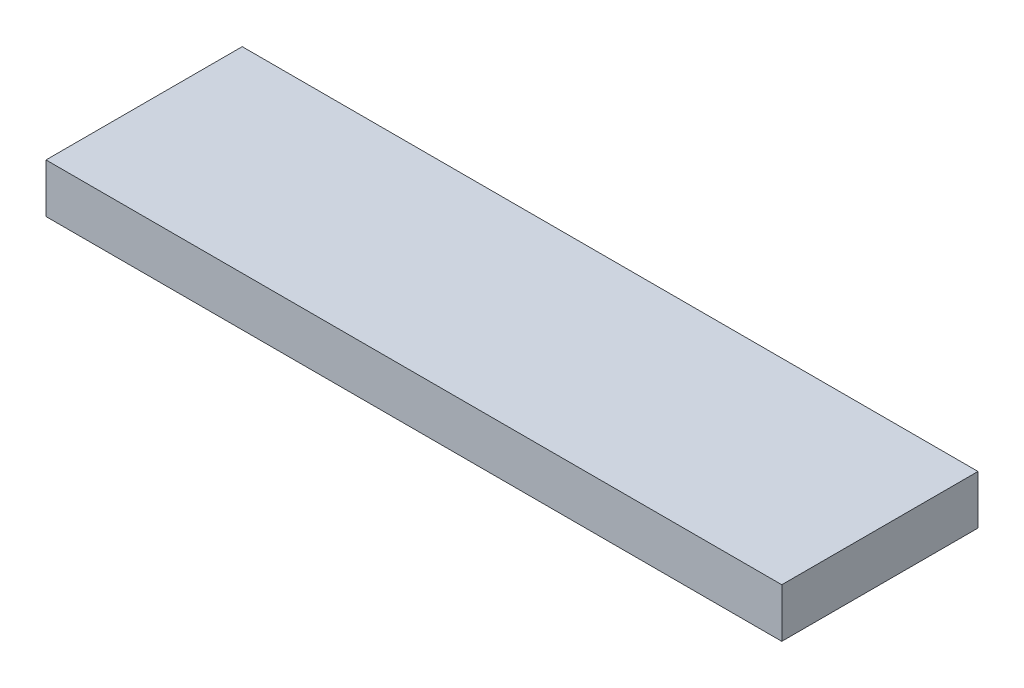
ISO-10303-21;
HEADER;
FILE_DESCRIPTION(('STEP AP214'),'2;1');
FILE_NAME('part.step','',(''),(''),'','','');
FILE_SCHEMA(('AUTOMOTIVE_DESIGN { 1 0 10303 214 1 1 1 1 }'));
ENDSEC;
DATA;
#1=APPLICATION_CONTEXT('core data for automotive mechanical design processes');
#2=APPLICATION_PROTOCOL_DEFINITION('international standard','automotive_design',2000,#1);
#3=PRODUCT_CONTEXT('',#1,'mechanical');
#4=PRODUCT('Part','Part','',(#3));
#5=PRODUCT_RELATED_PRODUCT_CATEGORY('part','',(#4));
#6=PRODUCT_DEFINITION_FORMATION('','',#4);
#7=PRODUCT_DEFINITION_CONTEXT('part definition',#1,'design');
#8=PRODUCT_DEFINITION('design','',#6,#7);
#9=PRODUCT_DEFINITION_SHAPE('','',#8);
#10=(LENGTH_UNIT() NAMED_UNIT(*) SI_UNIT(.MILLI.,.METRE.));
#11=(NAMED_UNIT(*) PLANE_ANGLE_UNIT() SI_UNIT($,.RADIAN.));
#12=(NAMED_UNIT(*) SI_UNIT($,.STERADIAN.) SOLID_ANGLE_UNIT());
#13=UNCERTAINTY_MEASURE_WITH_UNIT(LENGTH_MEASURE(1.E-05),#10,'distance_accuracy_value','');
#14=(GEOMETRIC_REPRESENTATION_CONTEXT(3) GLOBAL_UNCERTAINTY_ASSIGNED_CONTEXT((#13)) GLOBAL_UNIT_ASSIGNED_CONTEXT((#10,
#11,#12)) REPRESENTATION_CONTEXT('',''));
#15=CARTESIAN_POINT('',(0.,0.,0.));
#16=DIRECTION('',(0.,0.,1.));
#17=DIRECTION('',(1.,0.,0.));
#18=AXIS2_PLACEMENT_3D('',#15,#16,#17);
#19=CARTESIAN_POINT('',(0.,1.,0.));
#20=DIRECTION('',(1.,0.,0.));
#21=DIRECTION('',(0.,0.,-1.));
#22=AXIS2_PLACEMENT_3D('',#19,#20,#21);
#23=PLANE('',#22);
#24=DIRECTION('',(0.,0.,1.));
#25=VECTOR('',#24,1.);
#26=CARTESIAN_POINT('',(0.,0.,0.));
#27=LINE('',#26,#25);
#28=CARTESIAN_POINT('',(0.,0.,0.));
#29=VERTEX_POINT('',#28);
#30=CARTESIAN_POINT('',(0.,0.,4.));
#31=VERTEX_POINT('',#30);
#32=EDGE_CURVE('E100',#29,#31,#27,.T.);
#33=ORIENTED_EDGE('',*,*,#32,.T.);
#34=DIRECTION('',(0.,-1.,0.));
#35=VECTOR('',#34,1.);
#36=CARTESIAN_POINT('',(0.,1.,4.));
#37=LINE('',#36,#35);
#38=CARTESIAN_POINT('',(0.,1.,4.));
#39=VERTEX_POINT('',#38);
#40=EDGE_CURVE('E11',#39,#31,#37,.T.);
#41=ORIENTED_EDGE('',*,*,#40,.F.);
#42=DIRECTION('',(0.,0.,1.));
#43=VECTOR('',#42,1.);
#44=CARTESIAN_POINT('',(0.,1.,0.));
#45=LINE('',#44,#43);
#46=CARTESIAN_POINT('',(0.,1.,0.));
#47=VERTEX_POINT('',#46);
#48=EDGE_CURVE('E88',#47,#39,#45,.T.);
#49=ORIENTED_EDGE('',*,*,#48,.F.);
#50=DIRECTION('',(0.,-1.,0.));
#51=VECTOR('',#50,1.);
#52=CARTESIAN_POINT('',(0.,1.,0.));
#53=LINE('',#52,#51);
#54=EDGE_CURVE('E96',#47,#29,#53,.T.);
#55=ORIENTED_EDGE('',*,*,#54,.T.);
#56=EDGE_LOOP('',(#33,#41,#49,#55));
#57=FACE_BOUND('',#56,.T.);
#58=ADVANCED_FACE('F37',(#57),#23,.F.);
#59=CARTESIAN_POINT('',(0.,1.,4.));
#60=DIRECTION('',(0.,0.,-1.));
#61=DIRECTION('',(-1.,0.,0.));
#62=AXIS2_PLACEMENT_3D('',#59,#60,#61);
#63=PLANE('',#62);
#64=DIRECTION('',(1.,0.,0.));
#65=VECTOR('',#64,1.);
#66=CARTESIAN_POINT('',(0.,0.,4.));
#67=LINE('',#66,#65);
#68=CARTESIAN_POINT('',(15.,0.,4.));
#69=VERTEX_POINT('',#68);
#70=EDGE_CURVE('E92',#31,#69,#67,.T.);
#71=ORIENTED_EDGE('',*,*,#70,.T.);
#72=DIRECTION('',(0.,-1.,0.));
#73=VECTOR('',#72,1.);
#74=CARTESIAN_POINT('',(15.,1.,4.));
#75=LINE('',#74,#73);
#76=CARTESIAN_POINT('',(15.,1.,4.));
#77=VERTEX_POINT('',#76);
#78=EDGE_CURVE('E45',#77,#69,#75,.T.);
#79=ORIENTED_EDGE('',*,*,#78,.F.);
#80=DIRECTION('',(1.,0.,0.));
#81=VECTOR('',#80,1.);
#82=CARTESIAN_POINT('',(0.,1.,4.));
#83=LINE('',#82,#81);
#84=EDGE_CURVE('E83',#39,#77,#83,.T.);
#85=ORIENTED_EDGE('',*,*,#84,.F.);
#86=ORIENTED_EDGE('',*,*,#40,.T.);
#87=EDGE_LOOP('',(#71,#79,#85,#86));
#88=FACE_BOUND('',#87,.T.);
#89=ADVANCED_FACE('F91',(#88),#63,.F.);
#90=CARTESIAN_POINT('',(15.,1.,0.));
#91=DIRECTION('',(-1.,0.,0.));
#92=DIRECTION('',(0.,0.,1.));
#93=AXIS2_PLACEMENT_3D('',#90,#91,#92);
#94=PLANE('',#93);
#95=DIRECTION('',(0.,0.,-1.));
#96=VECTOR('',#95,1.);
#97=CARTESIAN_POINT('',(15.,0.,0.));
#98=LINE('',#97,#96);
#99=CARTESIAN_POINT('',(15.,0.,0.));
#100=VERTEX_POINT('',#99);
#101=EDGE_CURVE('E70',#69,#100,#98,.T.);
#102=ORIENTED_EDGE('',*,*,#101,.T.);
#103=DIRECTION('',(0.,-1.,0.));
#104=VECTOR('',#103,1.);
#105=CARTESIAN_POINT('',(15.,1.,0.));
#106=LINE('',#105,#104);
#107=CARTESIAN_POINT('',(15.,1.,0.));
#108=VERTEX_POINT('',#107);
#109=EDGE_CURVE('E93',#108,#100,#106,.T.);
#110=ORIENTED_EDGE('',*,*,#109,.F.);
#111=DIRECTION('',(0.,0.,-1.));
#112=VECTOR('',#111,1.);
#113=CARTESIAN_POINT('',(15.,1.,0.));
#114=LINE('',#113,#112);
#115=EDGE_CURVE('E86',#77,#108,#114,.T.);
#116=ORIENTED_EDGE('',*,*,#115,.F.);
#117=ORIENTED_EDGE('',*,*,#78,.T.);
#118=EDGE_LOOP('',(#102,#110,#116,#117));
#119=FACE_BOUND('',#118,.T.);
#120=ADVANCED_FACE('F94',(#119),#94,.F.);
#121=CARTESIAN_POINT('',(0.,1.,0.));
#122=DIRECTION('',(0.,0.,1.));
#123=DIRECTION('',(1.,0.,0.));
#124=AXIS2_PLACEMENT_3D('',#121,#122,#123);
#125=PLANE('',#124);
#126=DIRECTION('',(-1.,0.,0.));
#127=VECTOR('',#126,1.);
#128=CARTESIAN_POINT('',(0.,0.,0.));
#129=LINE('',#128,#127);
#130=EDGE_CURVE('E76',#100,#29,#129,.T.);
#131=ORIENTED_EDGE('',*,*,#130,.T.);
#132=ORIENTED_EDGE('',*,*,#54,.F.);
#133=DIRECTION('',(-1.,0.,0.));
#134=VECTOR('',#133,1.);
#135=CARTESIAN_POINT('',(0.,1.,0.));
#136=LINE('',#135,#134);
#137=EDGE_CURVE('E53',#108,#47,#136,.T.);
#138=ORIENTED_EDGE('',*,*,#137,.F.);
#139=ORIENTED_EDGE('',*,*,#109,.T.);
#140=EDGE_LOOP('',(#131,#132,#138,#139));
#141=FACE_BOUND('',#140,.T.);
#142=ADVANCED_FACE('F107',(#141),#125,.F.);
#143=CARTESIAN_POINT('',(0.,1.,0.));
#144=DIRECTION('',(0.,1.,0.));
#145=DIRECTION('',(0.,0.,1.));
#146=AXIS2_PLACEMENT_3D('',#143,#144,#145);
#147=PLANE('',#146);
#148=ORIENTED_EDGE('',*,*,#48,.T.);
#149=ORIENTED_EDGE('',*,*,#84,.T.);
#150=ORIENTED_EDGE('',*,*,#115,.T.);
#151=ORIENTED_EDGE('',*,*,#137,.T.);
#152=EDGE_LOOP('',(#148,#149,#150,#151));
#153=FACE_BOUND('',#152,.T.);
#154=ADVANCED_FACE('F84',(#153),#147,.T.);
#155=CARTESIAN_POINT('',(0.,0.,0.));
#156=DIRECTION('',(0.,1.,0.));
#157=DIRECTION('',(0.,0.,1.));
#158=AXIS2_PLACEMENT_3D('',#155,#156,#157);
#159=PLANE('',#158);
#160=ORIENTED_EDGE('',*,*,#32,.F.);
#161=ORIENTED_EDGE('',*,*,#130,.F.);
#162=ORIENTED_EDGE('',*,*,#101,.F.);
#163=ORIENTED_EDGE('',*,*,#70,.F.);
#164=EDGE_LOOP('',(#160,#161,#162,#163));
#165=FACE_BOUND('',#164,.T.);
#166=ADVANCED_FACE('F110',(#165),#159,.F.);
#167=CLOSED_SHELL('',(#58,#89,#120,#142,#154,#166));
#168=MANIFOLD_SOLID_BREP('B2',#167);
#169=ADVANCED_BREP_SHAPE_REPRESENTATION('',(#18,#168),#14);
#170=SHAPE_DEFINITION_REPRESENTATION(#9,#169);
ENDSEC;
END-ISO-10303-21;
